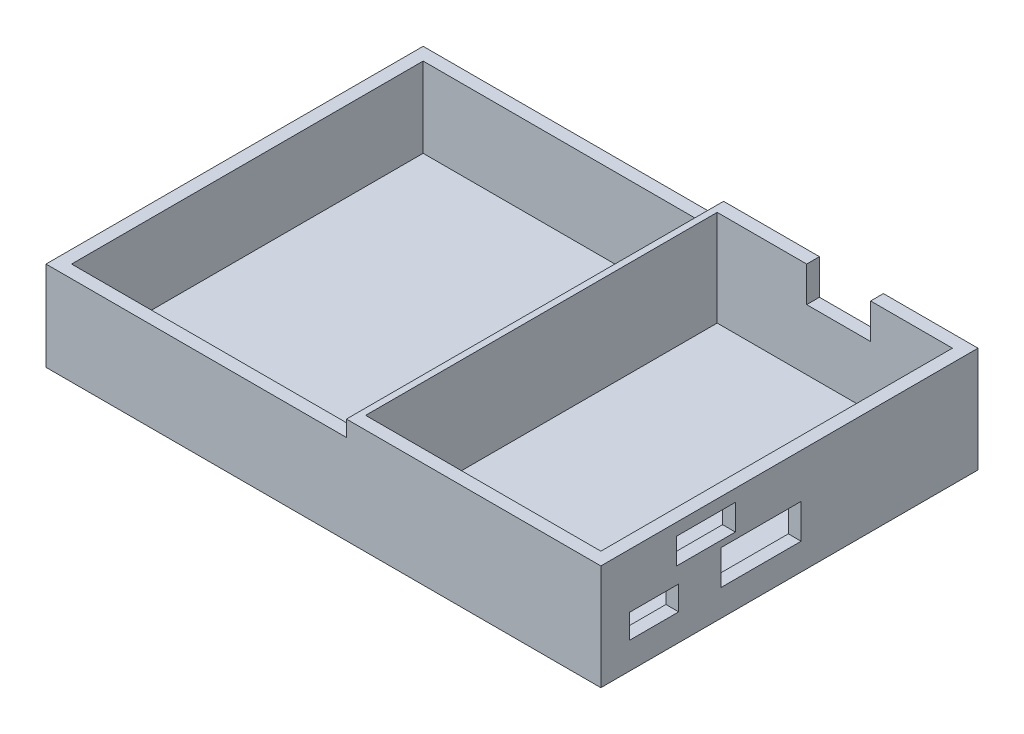
ISO-10303-21;
HEADER;
FILE_DESCRIPTION(('STEP AP214'),'2;1');
FILE_NAME('part.step','',(''),(''),'','','');
FILE_SCHEMA(('AUTOMOTIVE_DESIGN { 1 0 10303 214 1 1 1 1 }'));
ENDSEC;
DATA;
#1=APPLICATION_CONTEXT('core data for automotive mechanical design processes');
#2=APPLICATION_PROTOCOL_DEFINITION('international standard','automotive_design',2000,#1);
#3=PRODUCT_CONTEXT('',#1,'mechanical');
#4=PRODUCT('Part','Part','',(#3));
#5=PRODUCT_RELATED_PRODUCT_CATEGORY('part','',(#4));
#6=PRODUCT_DEFINITION_FORMATION('','',#4);
#7=PRODUCT_DEFINITION_CONTEXT('part definition',#1,'design');
#8=PRODUCT_DEFINITION('design','',#6,#7);
#9=PRODUCT_DEFINITION_SHAPE('','',#8);
#10=(LENGTH_UNIT() NAMED_UNIT(*) SI_UNIT(.MILLI.,.METRE.));
#11=(NAMED_UNIT(*) PLANE_ANGLE_UNIT() SI_UNIT($,.RADIAN.));
#12=(NAMED_UNIT(*) SI_UNIT($,.STERADIAN.) SOLID_ANGLE_UNIT());
#13=UNCERTAINTY_MEASURE_WITH_UNIT(LENGTH_MEASURE(1.E-05),#10,'distance_accuracy_value','');
#14=(GEOMETRIC_REPRESENTATION_CONTEXT(3) GLOBAL_UNCERTAINTY_ASSIGNED_CONTEXT((#13)) GLOBAL_UNIT_ASSIGNED_CONTEXT((#10,
#11,#12)) REPRESENTATION_CONTEXT('',''));
#15=CARTESIAN_POINT('',(0.,0.,0.));
#16=DIRECTION('',(0.,0.,1.));
#17=DIRECTION('',(1.,0.,0.));
#18=AXIS2_PLACEMENT_3D('',#15,#16,#17);
#19=CARTESIAN_POINT('',(0.,12.5,27.5));
#20=DIRECTION('',(0.,0.,1.));
#21=DIRECTION('',(1.,0.,0.));
#22=AXIS2_PLACEMENT_3D('',#19,#20,#21);
#23=PLANE('',#22);
#24=DIRECTION('',(-1.,0.,0.));
#25=VECTOR('',#24,1.);
#26=CARTESIAN_POINT('',(0.,12.5,27.5));
#27=LINE('',#26,#25);
#28=CARTESIAN_POINT('',(22.5,12.5,27.5));
#29=VERTEX_POINT('',#28);
#30=CARTESIAN_POINT('',(-22.5,12.5,27.5));
#31=VERTEX_POINT('',#30);
#32=EDGE_CURVE('E458',#29,#31,#27,.T.);
#33=ORIENTED_EDGE('',*,*,#32,.F.);
#34=DIRECTION('',(0.,-1.,0.));
#35=VECTOR('',#34,1.);
#36=CARTESIAN_POINT('',(22.5,15.,27.5));
#37=LINE('',#36,#35);
#38=CARTESIAN_POINT('',(22.5,0.,27.5));
#39=VERTEX_POINT('',#38);
#40=EDGE_CURVE('E400',#29,#39,#37,.T.);
#41=ORIENTED_EDGE('',*,*,#40,.T.);
#42=DIRECTION('',(-1.,0.,0.));
#43=VECTOR('',#42,1.);
#44=CARTESIAN_POINT('',(0.,0.,27.5));
#45=LINE('',#44,#43);
#46=CARTESIAN_POINT('',(-22.5,0.,27.5));
#47=VERTEX_POINT('',#46);
#48=EDGE_CURVE('E454',#39,#47,#45,.T.);
#49=ORIENTED_EDGE('',*,*,#48,.T.);
#50=DIRECTION('',(0.,-1.,0.));
#51=VECTOR('',#50,1.);
#52=CARTESIAN_POINT('',(-22.5,12.5,27.5));
#53=LINE('',#52,#51);
#54=EDGE_CURVE('E505',#31,#47,#53,.T.);
#55=ORIENTED_EDGE('',*,*,#54,.F.);
#56=EDGE_LOOP('',(#33,#41,#49,#55));
#57=FACE_BOUND('',#56,.T.);
#58=ADVANCED_FACE('F44',(#57),#23,.F.);
#59=CARTESIAN_POINT('',(0.,12.5,-27.5));
#60=DIRECTION('',(0.,0.,1.));
#61=DIRECTION('',(1.,0.,0.));
#62=AXIS2_PLACEMENT_3D('',#59,#60,#61);
#63=PLANE('',#62);
#64=DIRECTION('',(0.,-1.,0.));
#65=VECTOR('',#64,1.);
#66=CARTESIAN_POINT('',(22.5,15.,-27.5));
#67=LINE('',#66,#65);
#68=CARTESIAN_POINT('',(22.5,12.5,-27.5));
#69=VERTEX_POINT('',#68);
#70=CARTESIAN_POINT('',(22.5,0.,-27.5));
#71=VERTEX_POINT('',#70);
#72=EDGE_CURVE('E383',#69,#71,#67,.T.);
#73=ORIENTED_EDGE('',*,*,#72,.F.);
#74=DIRECTION('',(-1.,0.,0.));
#75=VECTOR('',#74,1.);
#76=CARTESIAN_POINT('',(0.,12.5,-27.5));
#77=LINE('',#76,#75);
#78=CARTESIAN_POINT('',(-22.5,12.5,-27.5));
#79=VERTEX_POINT('',#78);
#80=EDGE_CURVE('E465',#69,#79,#77,.T.);
#81=ORIENTED_EDGE('',*,*,#80,.T.);
#82=DIRECTION('',(0.,-1.,0.));
#83=VECTOR('',#82,1.);
#84=CARTESIAN_POINT('',(-22.5,12.5,-27.5));
#85=LINE('',#84,#83);
#86=CARTESIAN_POINT('',(-22.5,0.,-27.5));
#87=VERTEX_POINT('',#86);
#88=EDGE_CURVE('E501',#79,#87,#85,.T.);
#89=ORIENTED_EDGE('',*,*,#88,.T.);
#90=DIRECTION('',(-1.,0.,0.));
#91=VECTOR('',#90,1.);
#92=CARTESIAN_POINT('',(0.,0.,-27.5));
#93=LINE('',#92,#91);
#94=EDGE_CURVE('E492',#71,#87,#93,.T.);
#95=ORIENTED_EDGE('',*,*,#94,.F.);
#96=EDGE_LOOP('',(#73,#81,#89,#95));
#97=FACE_BOUND('',#96,.T.);
#98=ADVANCED_FACE('F623',(#97),#63,.T.);
#99=CARTESIAN_POINT('',(60.3,0.,27.5));
#100=VERTEX_POINT('',#99);
#101=CARTESIAN_POINT('',(23.5,0.,27.5));
#102=VERTEX_POINT('',#101);
#103=EDGE_CURVE('E485',#100,#102,#45,.T.);
#104=ORIENTED_EDGE('',*,*,#103,.T.);
#105=DIRECTION('',(0.,-1.,0.));
#106=VECTOR('',#105,1.);
#107=CARTESIAN_POINT('',(23.5,15.,27.5));
#108=LINE('',#107,#106);
#109=CARTESIAN_POINT('',(23.5,15.,27.5));
#110=VERTEX_POINT('',#109);
#111=EDGE_CURVE('E396',#110,#102,#108,.T.);
#112=ORIENTED_EDGE('',*,*,#111,.F.);
#113=DIRECTION('',(1.,0.,0.));
#114=VECTOR('',#113,1.);
#115=CARTESIAN_POINT('',(0.,15.,27.4999999999999));
#116=LINE('',#115,#114);
#117=CARTESIAN_POINT('',(60.3,15.,27.5));
#118=VERTEX_POINT('',#117);
#119=EDGE_CURVE('E405',#110,#118,#116,.T.);
#120=ORIENTED_EDGE('',*,*,#119,.T.);
#121=DIRECTION('',(0.,-1.,0.));
#122=VECTOR('',#121,1.);
#123=CARTESIAN_POINT('',(60.3,15.,27.5));
#124=LINE('',#123,#122);
#125=EDGE_CURVE('E431',#118,#100,#124,.T.);
#126=ORIENTED_EDGE('',*,*,#125,.T.);
#127=EDGE_LOOP('',(#104,#112,#120,#126));
#128=FACE_BOUND('',#127,.T.);
#129=ADVANCED_FACE('F46',(#128),#23,.F.);
#130=CARTESIAN_POINT('',(-22.5,12.5,0.));
#131=DIRECTION('',(-1.,0.,0.));
#132=DIRECTION('',(0.,0.,1.));
#133=AXIS2_PLACEMENT_3D('',#130,#131,#132);
#134=PLANE('',#133);
#135=DIRECTION('',(0.,0.,-1.));
#136=VECTOR('',#135,1.);
#137=CARTESIAN_POINT('',(-22.5,0.,0.));
#138=LINE('',#137,#136);
#139=EDGE_CURVE('E488',#47,#87,#138,.T.);
#140=ORIENTED_EDGE('',*,*,#139,.T.);
#141=ORIENTED_EDGE('',*,*,#88,.F.);
#142=DIRECTION('',(0.,0.,-1.));
#143=VECTOR('',#142,1.);
#144=CARTESIAN_POINT('',(-22.5,12.5,0.));
#145=LINE('',#144,#143);
#146=EDGE_CURVE('E462',#31,#79,#145,.T.);
#147=ORIENTED_EDGE('',*,*,#146,.F.);
#148=ORIENTED_EDGE('',*,*,#54,.T.);
#149=EDGE_LOOP('',(#140,#141,#147,#148));
#150=FACE_BOUND('',#149,.T.);
#151=ADVANCED_FACE('F620',(#150),#134,.F.);
#152=DIRECTION('',(0.,1.,0.));
#153=VECTOR('',#152,1.);
#154=CARTESIAN_POINT('',(47.5,12.5,-27.5));
#155=LINE('',#154,#153);
#156=CARTESIAN_POINT('',(47.5,9.5,-27.5));
#157=VERTEX_POINT('',#156);
#158=CARTESIAN_POINT('',(47.5,15.,-27.5));
#159=VERTEX_POINT('',#158);
#160=EDGE_CURVE('E275',#157,#159,#155,.T.);
#161=ORIENTED_EDGE('',*,*,#160,.F.);
#162=DIRECTION('',(1.,0.,0.));
#163=VECTOR('',#162,1.);
#164=CARTESIAN_POINT('',(0.,9.5,-27.5));
#165=LINE('',#164,#163);
#166=CARTESIAN_POINT('',(37.5,9.5,-27.5));
#167=VERTEX_POINT('',#166);
#168=EDGE_CURVE('E249',#167,#157,#165,.T.);
#169=ORIENTED_EDGE('',*,*,#168,.F.);
#170=DIRECTION('',(0.,-1.,0.));
#171=VECTOR('',#170,1.);
#172=CARTESIAN_POINT('',(37.5,12.5,-27.5));
#173=LINE('',#172,#171);
#174=CARTESIAN_POINT('',(37.5,15.,-27.5));
#175=VERTEX_POINT('',#174);
#176=EDGE_CURVE('E271',#175,#167,#173,.T.);
#177=ORIENTED_EDGE('',*,*,#176,.F.);
#178=DIRECTION('',(1.,0.,0.));
#179=VECTOR('',#178,1.);
#180=CARTESIAN_POINT('',(1.9081958235745E-13,15.,-27.5000000000002));
#181=LINE('',#180,#179);
#182=CARTESIAN_POINT('',(23.5,15.,-27.5));
#183=VERTEX_POINT('',#182);
#184=EDGE_CURVE('E423',#183,#175,#181,.T.);
#185=ORIENTED_EDGE('',*,*,#184,.F.);
#186=DIRECTION('',(0.,-1.,0.));
#187=VECTOR('',#186,1.);
#188=CARTESIAN_POINT('',(23.5,15.,-27.5));
#189=LINE('',#188,#187);
#190=CARTESIAN_POINT('',(23.5,0.,-27.5));
#191=VERTEX_POINT('',#190);
#192=EDGE_CURVE('E393',#183,#191,#189,.T.);
#193=ORIENTED_EDGE('',*,*,#192,.T.);
#194=CARTESIAN_POINT('',(60.3,0.,-27.5));
#195=VERTEX_POINT('',#194);
#196=EDGE_CURVE('E459',#195,#191,#93,.T.);
#197=ORIENTED_EDGE('',*,*,#196,.F.);
#198=DIRECTION('',(0.,-1.,0.));
#199=VECTOR('',#198,1.);
#200=CARTESIAN_POINT('',(60.3,15.,-27.5));
#201=LINE('',#200,#199);
#202=CARTESIAN_POINT('',(60.3,15.,-27.5));
#203=VERTEX_POINT('',#202);
#204=EDGE_CURVE('E437',#203,#195,#201,.T.);
#205=ORIENTED_EDGE('',*,*,#204,.F.);
#206=EDGE_CURVE('E422',#159,#203,#181,.T.);
#207=ORIENTED_EDGE('',*,*,#206,.F.);
#208=EDGE_LOOP('',(#161,#169,#177,#185,#193,#197,#205,#207));
#209=FACE_BOUND('',#208,.T.);
#210=ADVANCED_FACE('F563',(#209),#63,.T.);
#211=CARTESIAN_POINT('',(0.,12.5,-29.5));
#212=DIRECTION('',(0.,0.,1.));
#213=DIRECTION('',(1.,0.,0.));
#214=AXIS2_PLACEMENT_3D('',#211,#212,#213);
#215=PLANE('',#214);
#216=DIRECTION('',(-1.,0.,0.));
#217=VECTOR('',#216,1.);
#218=CARTESIAN_POINT('',(47.5,9.5,-29.5));
#219=LINE('',#218,#217);
#220=CARTESIAN_POINT('',(47.5,9.5,-29.5));
#221=VERTEX_POINT('',#220);
#222=CARTESIAN_POINT('',(37.5,9.5,-29.5));
#223=VERTEX_POINT('',#222);
#224=EDGE_CURVE('E247',#221,#223,#219,.T.);
#225=ORIENTED_EDGE('',*,*,#224,.F.);
#226=DIRECTION('',(0.,-1.,0.));
#227=VECTOR('',#226,1.);
#228=CARTESIAN_POINT('',(47.5,15.,-29.5));
#229=LINE('',#228,#227);
#230=CARTESIAN_POINT('',(47.5,15.,-29.5));
#231=VERTEX_POINT('',#230);
#232=EDGE_CURVE('E256',#231,#221,#229,.T.);
#233=ORIENTED_EDGE('',*,*,#232,.F.);
#234=DIRECTION('',(1.,0.,0.));
#235=VECTOR('',#234,1.);
#236=CARTESIAN_POINT('',(0.,15.,-29.5));
#237=LINE('',#236,#235);
#238=CARTESIAN_POINT('',(62.3,15.,-29.5));
#239=VERTEX_POINT('',#238);
#240=EDGE_CURVE('E418',#231,#239,#237,.T.);
#241=ORIENTED_EDGE('',*,*,#240,.T.);
#242=DIRECTION('',(0.,-1.,0.));
#243=VECTOR('',#242,1.);
#244=CARTESIAN_POINT('',(62.3,15.,-29.5));
#245=LINE('',#244,#243);
#246=CARTESIAN_POINT('',(62.3,-1.5,-29.5));
#247=VERTEX_POINT('',#246);
#248=EDGE_CURVE('E444',#239,#247,#245,.T.);
#249=ORIENTED_EDGE('',*,*,#248,.T.);
#250=DIRECTION('',(-1.,0.,0.));
#251=VECTOR('',#250,1.);
#252=CARTESIAN_POINT('',(0.,-1.5,-29.5));
#253=LINE('',#252,#251);
#254=CARTESIAN_POINT('',(-24.5,-1.5,-29.5));
#255=VERTEX_POINT('',#254);
#256=EDGE_CURVE('E370',#247,#255,#253,.T.);
#257=ORIENTED_EDGE('',*,*,#256,.T.);
#258=DIRECTION('',(0.,-1.,0.));
#259=VECTOR('',#258,1.);
#260=CARTESIAN_POINT('',(-24.5,12.5,-29.5));
#261=LINE('',#260,#259);
#262=CARTESIAN_POINT('',(-24.5,12.5,-29.5));
#263=VERTEX_POINT('',#262);
#264=EDGE_CURVE('E498',#263,#255,#261,.T.);
#265=ORIENTED_EDGE('',*,*,#264,.F.);
#266=DIRECTION('',(-1.,0.,0.));
#267=VECTOR('',#266,1.);
#268=CARTESIAN_POINT('',(0.,12.5,-29.5));
#269=LINE('',#268,#267);
#270=CARTESIAN_POINT('',(22.5,12.5,-29.5));
#271=VERTEX_POINT('',#270);
#272=EDGE_CURVE('E473',#271,#263,#269,.T.);
#273=ORIENTED_EDGE('',*,*,#272,.F.);
#274=DIRECTION('',(0.,-1.,0.));
#275=VECTOR('',#274,1.);
#276=CARTESIAN_POINT('',(22.5,15.,-29.5));
#277=LINE('',#276,#275);
#278=CARTESIAN_POINT('',(22.5,15.,-29.5));
#279=VERTEX_POINT('',#278);
#280=EDGE_CURVE('E441',#279,#271,#277,.T.);
#281=ORIENTED_EDGE('',*,*,#280,.F.);
#282=CARTESIAN_POINT('',(37.5,15.,-29.5));
#283=VERTEX_POINT('',#282);
#284=EDGE_CURVE('E419',#279,#283,#237,.T.);
#285=ORIENTED_EDGE('',*,*,#284,.T.);
#286=DIRECTION('',(0.,1.,0.));
#287=VECTOR('',#286,1.);
#288=CARTESIAN_POINT('',(37.5,15.,-29.5));
#289=LINE('',#288,#287);
#290=EDGE_CURVE('E60',#223,#283,#289,.T.);
#291=ORIENTED_EDGE('',*,*,#290,.F.);
#292=EDGE_LOOP('',(#225,#233,#241,#249,#257,#265,#273,#281,#285,#291));
#293=FACE_BOUND('',#292,.T.);
#294=ADVANCED_FACE('F263',(#293),#215,.F.);
#295=CARTESIAN_POINT('',(-24.5,12.5,0.));
#296=DIRECTION('',(-1.,0.,0.));
#297=DIRECTION('',(0.,0.,1.));
#298=AXIS2_PLACEMENT_3D('',#295,#296,#297);
#299=PLANE('',#298);
#300=ORIENTED_EDGE('',*,*,#264,.T.);
#301=DIRECTION('',(0.,0.,-1.));
#302=VECTOR('',#301,1.);
#303=CARTESIAN_POINT('',(-24.5,-1.5,0.));
#304=LINE('',#303,#302);
#305=CARTESIAN_POINT('',(-24.5,-1.5,29.5));
#306=VERTEX_POINT('',#305);
#307=EDGE_CURVE('E374',#306,#255,#304,.T.);
#308=ORIENTED_EDGE('',*,*,#307,.F.);
#309=DIRECTION('',(0.,-1.,0.));
#310=VECTOR('',#309,1.);
#311=CARTESIAN_POINT('',(-24.5,12.5,29.5));
#312=LINE('',#311,#310);
#313=CARTESIAN_POINT('',(-24.5,12.5,29.5));
#314=VERTEX_POINT('',#313);
#315=EDGE_CURVE('E484',#314,#306,#312,.T.);
#316=ORIENTED_EDGE('',*,*,#315,.F.);
#317=DIRECTION('',(0.,0.,-1.));
#318=VECTOR('',#317,1.);
#319=CARTESIAN_POINT('',(-24.5,12.5,0.));
#320=LINE('',#319,#318);
#321=EDGE_CURVE('E476',#314,#263,#320,.T.);
#322=ORIENTED_EDGE('',*,*,#321,.T.);
#323=EDGE_LOOP('',(#300,#308,#316,#322));
#324=FACE_BOUND('',#323,.T.);
#325=ADVANCED_FACE('F604',(#324),#299,.T.);
#326=CARTESIAN_POINT('',(0.,12.5,29.5));
#327=DIRECTION('',(0.,0.,1.));
#328=DIRECTION('',(1.,0.,0.));
#329=AXIS2_PLACEMENT_3D('',#326,#327,#328);
#330=PLANE('',#329);
#331=ORIENTED_EDGE('',*,*,#315,.T.);
#332=DIRECTION('',(-1.,0.,0.));
#333=VECTOR('',#332,1.);
#334=CARTESIAN_POINT('',(0.,-1.5,29.5));
#335=LINE('',#334,#333);
#336=CARTESIAN_POINT('',(62.3,-1.5,29.5));
#337=VERTEX_POINT('',#336);
#338=EDGE_CURVE('E353',#337,#306,#335,.T.);
#339=ORIENTED_EDGE('',*,*,#338,.F.);
#340=DIRECTION('',(0.,-1.,0.));
#341=VECTOR('',#340,1.);
#342=CARTESIAN_POINT('',(62.3,15.,29.5));
#343=LINE('',#342,#341);
#344=CARTESIAN_POINT('',(62.3,15.,29.5));
#345=VERTEX_POINT('',#344);
#346=EDGE_CURVE('E447',#345,#337,#343,.T.);
#347=ORIENTED_EDGE('',*,*,#346,.F.);
#348=DIRECTION('',(1.,0.,0.));
#349=VECTOR('',#348,1.);
#350=CARTESIAN_POINT('',(0.,15.,29.5));
#351=LINE('',#350,#349);
#352=CARTESIAN_POINT('',(22.5,15.,29.5));
#353=VERTEX_POINT('',#352);
#354=EDGE_CURVE('E411',#353,#345,#351,.T.);
#355=ORIENTED_EDGE('',*,*,#354,.F.);
#356=DIRECTION('',(0.,-1.,0.));
#357=VECTOR('',#356,1.);
#358=CARTESIAN_POINT('',(22.5,15.,29.5));
#359=LINE('',#358,#357);
#360=CARTESIAN_POINT('',(22.5,12.5,29.5));
#361=VERTEX_POINT('',#360);
#362=EDGE_CURVE('E450',#353,#361,#359,.T.);
#363=ORIENTED_EDGE('',*,*,#362,.T.);
#364=DIRECTION('',(-1.,0.,0.));
#365=VECTOR('',#364,1.);
#366=CARTESIAN_POINT('',(0.,12.5,29.5));
#367=LINE('',#366,#365);
#368=EDGE_CURVE('E480',#361,#314,#367,.T.);
#369=ORIENTED_EDGE('',*,*,#368,.T.);
#370=EDGE_LOOP('',(#331,#339,#347,#355,#363,#369));
#371=FACE_BOUND('',#370,.T.);
#372=ADVANCED_FACE('F594',(#371),#330,.T.);
#373=CARTESIAN_POINT('',(0.,12.5,0.));
#374=DIRECTION('',(0.,1.,0.));
#375=DIRECTION('',(0.,0.,1.));
#376=AXIS2_PLACEMENT_3D('',#373,#374,#375);
#377=PLANE('',#376);
#378=DIRECTION('',(0.,0.,1.));
#379=VECTOR('',#378,1.);
#380=CARTESIAN_POINT('',(22.5,12.5,0.));
#381=LINE('',#380,#379);
#382=EDGE_CURVE('E455',#29,#361,#381,.T.);
#383=ORIENTED_EDGE('',*,*,#382,.F.);
#384=ORIENTED_EDGE('',*,*,#32,.T.);
#385=ORIENTED_EDGE('',*,*,#146,.T.);
#386=ORIENTED_EDGE('',*,*,#80,.F.);
#387=DIRECTION('',(0.,0.,1.));
#388=VECTOR('',#387,1.);
#389=CARTESIAN_POINT('',(22.5,12.5,0.));
#390=LINE('',#389,#388);
#391=EDGE_CURVE('E469',#271,#69,#390,.T.);
#392=ORIENTED_EDGE('',*,*,#391,.F.);
#393=ORIENTED_EDGE('',*,*,#272,.T.);
#394=ORIENTED_EDGE('',*,*,#321,.F.);
#395=ORIENTED_EDGE('',*,*,#368,.F.);
#396=EDGE_LOOP('',(#383,#384,#385,#386,#392,#393,#394,#395));
#397=FACE_BOUND('',#396,.T.);
#398=ADVANCED_FACE('F608',(#397),#377,.T.);
#399=CARTESIAN_POINT('',(22.5,15.,0.));
#400=DIRECTION('',(1.,0.,0.));
#401=DIRECTION('',(0.,0.,-1.));
#402=AXIS2_PLACEMENT_3D('',#399,#400,#401);
#403=PLANE('',#402);
#404=ORIENTED_EDGE('',*,*,#382,.T.);
#405=ORIENTED_EDGE('',*,*,#362,.F.);
#406=DIRECTION('',(0.,0.,1.));
#407=VECTOR('',#406,1.);
#408=CARTESIAN_POINT('',(22.5,15.,0.));
#409=LINE('',#408,#407);
#410=EDGE_CURVE('E408',#279,#353,#409,.T.);
#411=ORIENTED_EDGE('',*,*,#410,.F.);
#412=ORIENTED_EDGE('',*,*,#280,.T.);
#413=ORIENTED_EDGE('',*,*,#391,.T.);
#414=ORIENTED_EDGE('',*,*,#72,.T.);
#415=DIRECTION('',(0.,0.,-1.));
#416=VECTOR('',#415,1.);
#417=CARTESIAN_POINT('',(22.5,0.,0.));
#418=LINE('',#417,#416);
#419=EDGE_CURVE('E378',#39,#71,#418,.T.);
#420=ORIENTED_EDGE('',*,*,#419,.F.);
#421=ORIENTED_EDGE('',*,*,#40,.F.);
#422=EDGE_LOOP('',(#404,#405,#411,#412,#413,#414,#420,#421));
#423=FACE_BOUND('',#422,.T.);
#424=ADVANCED_FACE('F610',(#423),#403,.F.);
#425=CARTESIAN_POINT('',(62.3,15.,0.));
#426=DIRECTION('',(1.,0.,0.));
#427=DIRECTION('',(0.,0.,-1.));
#428=AXIS2_PLACEMENT_3D('',#425,#426,#427);
#429=PLANE('',#428);
#430=DIRECTION('',(0.,0.,-1.));
#431=VECTOR('',#430,1.);
#432=CARTESIAN_POINT('',(62.3,2.68005623563339,10.670199999999));
#433=LINE('',#432,#431);
#434=CARTESIAN_POINT('',(62.3,2.68005623563339,10.670199999999));
#435=VERTEX_POINT('',#434);
#436=CARTESIAN_POINT('',(62.3,2.68005623563339,-1.829800000001));
#437=VERTEX_POINT('',#436);
#438=EDGE_CURVE('E68',#435,#437,#433,.T.);
#439=ORIENTED_EDGE('',*,*,#438,.F.);
#440=DIRECTION('',(0.,-1.,0.));
#441=VECTOR('',#440,1.);
#442=CARTESIAN_POINT('',(62.3,2.68005623563339,10.670199999999));
#443=LINE('',#442,#441);
#444=CARTESIAN_POINT('',(62.3,8.08005623563339,10.670199999999));
#445=VERTEX_POINT('',#444);
#446=EDGE_CURVE('E313',#445,#435,#443,.T.);
#447=ORIENTED_EDGE('',*,*,#446,.F.);
#448=DIRECTION('',(0.,0.,1.));
#449=VECTOR('',#448,1.);
#450=CARTESIAN_POINT('',(62.3,8.08005623563339,10.670199999999));
#451=LINE('',#450,#449);
#452=CARTESIAN_POINT('',(62.3,8.08005623563339,-1.829800000001));
#453=VERTEX_POINT('',#452);
#454=EDGE_CURVE('E325',#453,#445,#451,.T.);
#455=ORIENTED_EDGE('',*,*,#454,.F.);
#456=DIRECTION('',(0.,1.,0.));
#457=VECTOR('',#456,1.);
#458=CARTESIAN_POINT('',(62.3,2.68005623563339,-1.829800000001));
#459=LINE('',#458,#457);
#460=EDGE_CURVE('E329',#437,#453,#459,.T.);
#461=ORIENTED_EDGE('',*,*,#460,.F.);
#462=EDGE_LOOP('',(#439,#447,#455,#461));
#463=FACE_BOUND('',#462,.T.);
#464=DIRECTION('',(0.,-1.,0.));
#465=VECTOR('',#464,1.);
#466=CARTESIAN_POINT('',(62.3,9.06825733,17.6602083341472));
#467=LINE('',#466,#465);
#468=CARTESIAN_POINT('',(62.3,13.1,17.6602083341472));
#469=VERTEX_POINT('',#468);
#470=CARTESIAN_POINT('',(62.3,9.06825733,17.6602083341472));
#471=VERTEX_POINT('',#470);
#472=EDGE_CURVE('E306',#469,#471,#467,.T.);
#473=ORIENTED_EDGE('',*,*,#472,.F.);
#474=DIRECTION('',(0.,0.,1.));
#475=VECTOR('',#474,1.);
#476=CARTESIAN_POINT('',(62.3,13.1,17.6602083341472));
#477=LINE('',#476,#475);
#478=CARTESIAN_POINT('',(62.3,13.1,8.46020833414721));
#479=VERTEX_POINT('',#478);
#480=EDGE_CURVE('E285',#479,#469,#477,.T.);
#481=ORIENTED_EDGE('',*,*,#480,.F.);
#482=DIRECTION('',(0.,1.,0.));
#483=VECTOR('',#482,1.);
#484=CARTESIAN_POINT('',(62.3,9.06825733,8.46020833414721));
#485=LINE('',#484,#483);
#486=CARTESIAN_POINT('',(62.3,9.06825733,8.46020833414721));
#487=VERTEX_POINT('',#486);
#488=EDGE_CURVE('E298',#487,#479,#485,.T.);
#489=ORIENTED_EDGE('',*,*,#488,.F.);
#490=DIRECTION('',(0.,0.,-1.));
#491=VECTOR('',#490,1.);
#492=CARTESIAN_POINT('',(62.3,9.06825733,17.6602083341472));
#493=LINE('',#492,#491);
#494=EDGE_CURVE('E302',#471,#487,#493,.T.);
#495=ORIENTED_EDGE('',*,*,#494,.F.);
#496=EDGE_LOOP('',(#473,#481,#489,#495));
#497=FACE_BOUND('',#496,.T.);
#498=DIRECTION('',(0.,-1.,0.));
#499=VECTOR('',#498,1.);
#500=CARTESIAN_POINT('',(62.3,2.68477666438514,25.));
#501=LINE('',#500,#499);
#502=CARTESIAN_POINT('',(62.3,6.47005623563348,25.));
#503=VERTEX_POINT('',#502);
#504=CARTESIAN_POINT('',(62.3,2.68477666438514,25.));
#505=VERTEX_POINT('',#504);
#506=EDGE_CURVE('E309',#503,#505,#501,.T.);
#507=ORIENTED_EDGE('',*,*,#506,.F.);
#508=DIRECTION('',(0.,0.,1.));
#509=VECTOR('',#508,1.);
#510=CARTESIAN_POINT('',(62.3,6.47005623563348,25.));
#511=LINE('',#510,#509);
#512=CARTESIAN_POINT('',(62.3,6.47005623563348,17.317199999999));
#513=VERTEX_POINT('',#512);
#514=EDGE_CURVE('E345',#513,#503,#511,.T.);
#515=ORIENTED_EDGE('',*,*,#514,.F.);
#516=DIRECTION('',(0.,1.,0.));
#517=VECTOR('',#516,1.);
#518=CARTESIAN_POINT('',(62.3,2.68477666438514,17.317199999999));
#519=LINE('',#518,#517);
#520=CARTESIAN_POINT('',(62.3,2.68477666438514,17.317199999999));
#521=VERTEX_POINT('',#520);
#522=EDGE_CURVE('E341',#521,#513,#519,.T.);
#523=ORIENTED_EDGE('',*,*,#522,.F.);
#524=DIRECTION('',(0.,0.,-1.));
#525=VECTOR('',#524,1.);
#526=CARTESIAN_POINT('',(62.3,2.68477666438514,25.));
#527=LINE('',#526,#525);
#528=EDGE_CURVE('E337',#505,#521,#527,.T.);
#529=ORIENTED_EDGE('',*,*,#528,.F.);
#530=EDGE_LOOP('',(#507,#515,#523,#529));
#531=FACE_BOUND('',#530,.T.);
#532=ORIENTED_EDGE('',*,*,#346,.T.);
#533=DIRECTION('',(0.,0.,1.));
#534=VECTOR('',#533,1.);
#535=CARTESIAN_POINT('',(62.3,-1.5,0.));
#536=LINE('',#535,#534);
#537=EDGE_CURVE('E366',#247,#337,#536,.T.);
#538=ORIENTED_EDGE('',*,*,#537,.F.);
#539=ORIENTED_EDGE('',*,*,#248,.F.);
#540=DIRECTION('',(0.,0.,1.));
#541=VECTOR('',#540,1.);
#542=CARTESIAN_POINT('',(62.3,15.,0.));
#543=LINE('',#542,#541);
#544=EDGE_CURVE('E414',#239,#345,#543,.T.);
#545=ORIENTED_EDGE('',*,*,#544,.T.);
#546=EDGE_LOOP('',(#532,#538,#539,#545));
#547=FACE_BOUND('',#546,.T.);
#548=ADVANCED_FACE('F587',(#463,#497,#531,#547),#429,.T.);
#549=CARTESIAN_POINT('',(60.3,15.,0.));
#550=DIRECTION('',(1.,0.,0.));
#551=DIRECTION('',(0.,0.,-1.));
#552=AXIS2_PLACEMENT_3D('',#549,#550,#551);
#553=PLANE('',#552);
#554=DIRECTION('',(0.,-1.,0.));
#555=VECTOR('',#554,1.);
#556=CARTESIAN_POINT('',(60.3,15.,10.670199999999));
#557=LINE('',#556,#555);
#558=CARTESIAN_POINT('',(60.3,8.08005623563339,10.670199999999));
#559=VERTEX_POINT('',#558);
#560=CARTESIAN_POINT('',(60.3,2.68005623563339,10.670199999999));
#561=VERTEX_POINT('',#560);
#562=EDGE_CURVE('E549',#559,#561,#557,.T.);
#563=ORIENTED_EDGE('',*,*,#562,.T.);
#564=DIRECTION('',(0.,0.,-1.));
#565=VECTOR('',#564,1.);
#566=CARTESIAN_POINT('',(60.3,2.68005623563339,0.));
#567=LINE('',#566,#565);
#568=CARTESIAN_POINT('',(60.3,2.68005623563339,-1.829800000001));
#569=VERTEX_POINT('',#568);
#570=EDGE_CURVE('E553',#561,#569,#567,.T.);
#571=ORIENTED_EDGE('',*,*,#570,.T.);
#572=DIRECTION('',(0.,1.,0.));
#573=VECTOR('',#572,1.);
#574=CARTESIAN_POINT('',(60.3,15.,-1.829800000001));
#575=LINE('',#574,#573);
#576=CARTESIAN_POINT('',(60.3,8.08005623563339,-1.829800000001));
#577=VERTEX_POINT('',#576);
#578=EDGE_CURVE('E541',#569,#577,#575,.T.);
#579=ORIENTED_EDGE('',*,*,#578,.T.);
#580=DIRECTION('',(0.,0.,1.));
#581=VECTOR('',#580,1.);
#582=CARTESIAN_POINT('',(60.3,8.08005623563339,0.));
#583=LINE('',#582,#581);
#584=EDGE_CURVE('E545',#577,#559,#583,.T.);
#585=ORIENTED_EDGE('',*,*,#584,.T.);
#586=EDGE_LOOP('',(#563,#571,#579,#585));
#587=FACE_BOUND('',#586,.T.);
#588=DIRECTION('',(0.,0.,1.));
#589=VECTOR('',#588,1.);
#590=CARTESIAN_POINT('',(60.3,13.1,0.));
#591=LINE('',#590,#589);
#592=CARTESIAN_POINT('',(60.3,13.1,8.46020833414721));
#593=VERTEX_POINT('',#592);
#594=CARTESIAN_POINT('',(60.3,13.1,17.6602083341472));
#595=VERTEX_POINT('',#594);
#596=EDGE_CURVE('E533',#593,#595,#591,.T.);
#597=ORIENTED_EDGE('',*,*,#596,.T.);
#598=DIRECTION('',(0.,-1.,0.));
#599=VECTOR('',#598,1.);
#600=CARTESIAN_POINT('',(60.3,15.,17.6602083341472));
#601=LINE('',#600,#599);
#602=CARTESIAN_POINT('',(60.3,9.06825733,17.6602083341472));
#603=VERTEX_POINT('',#602);
#604=EDGE_CURVE('E537',#595,#603,#601,.T.);
#605=ORIENTED_EDGE('',*,*,#604,.T.);
#606=DIRECTION('',(0.,0.,-1.));
#607=VECTOR('',#606,1.);
#608=CARTESIAN_POINT('',(60.3,9.06825733,0.));
#609=LINE('',#608,#607);
#610=CARTESIAN_POINT('',(60.3,9.06825733,8.46020833414721));
#611=VERTEX_POINT('',#610);
#612=EDGE_CURVE('E525',#603,#611,#609,.T.);
#613=ORIENTED_EDGE('',*,*,#612,.T.);
#614=DIRECTION('',(0.,1.,0.));
#615=VECTOR('',#614,1.);
#616=CARTESIAN_POINT('',(60.3,15.,8.46020833414721));
#617=LINE('',#616,#615);
#618=EDGE_CURVE('E529',#611,#593,#617,.T.);
#619=ORIENTED_EDGE('',*,*,#618,.T.);
#620=EDGE_LOOP('',(#597,#605,#613,#619));
#621=FACE_BOUND('',#620,.T.);
#622=DIRECTION('',(0.,0.,1.));
#623=VECTOR('',#622,1.);
#624=CARTESIAN_POINT('',(60.3,6.47005623563348,0.));
#625=LINE('',#624,#623);
#626=CARTESIAN_POINT('',(60.3,6.47005623563348,17.317199999999));
#627=VERTEX_POINT('',#626);
#628=CARTESIAN_POINT('',(60.3,6.47005623563348,25.));
#629=VERTEX_POINT('',#628);
#630=EDGE_CURVE('E517',#627,#629,#625,.T.);
#631=ORIENTED_EDGE('',*,*,#630,.T.);
#632=DIRECTION('',(0.,-1.,0.));
#633=VECTOR('',#632,1.);
#634=CARTESIAN_POINT('',(60.3,15.,25.));
#635=LINE('',#634,#633);
#636=CARTESIAN_POINT('',(60.3,2.68477666438514,25.));
#637=VERTEX_POINT('',#636);
#638=EDGE_CURVE('E521',#629,#637,#635,.T.);
#639=ORIENTED_EDGE('',*,*,#638,.T.);
#640=DIRECTION('',(0.,0.,-1.));
#641=VECTOR('',#640,1.);
#642=CARTESIAN_POINT('',(60.3,2.68477666438514,0.));
#643=LINE('',#642,#641);
#644=CARTESIAN_POINT('',(60.3,2.68477666438514,17.317199999999));
#645=VERTEX_POINT('',#644);
#646=EDGE_CURVE('E509',#637,#645,#643,.T.);
#647=ORIENTED_EDGE('',*,*,#646,.T.);
#648=DIRECTION('',(0.,1.,0.));
#649=VECTOR('',#648,1.);
#650=CARTESIAN_POINT('',(60.3,15.,17.317199999999));
#651=LINE('',#650,#649);
#652=EDGE_CURVE('E513',#645,#627,#651,.T.);
#653=ORIENTED_EDGE('',*,*,#652,.T.);
#654=EDGE_LOOP('',(#631,#639,#647,#653));
#655=FACE_BOUND('',#654,.T.);
#656=DIRECTION('',(0.,0.,1.));
#657=VECTOR('',#656,1.);
#658=CARTESIAN_POINT('',(60.3,0.,0.));
#659=LINE('',#658,#657);
#660=EDGE_CURVE('E404',#195,#100,#659,.T.);
#661=ORIENTED_EDGE('',*,*,#660,.T.);
#662=ORIENTED_EDGE('',*,*,#125,.F.);
#663=DIRECTION('',(0.,0.,1.));
#664=VECTOR('',#663,1.);
#665=CARTESIAN_POINT('',(60.3,15.,0.));
#666=LINE('',#665,#664);
#667=EDGE_CURVE('E427',#203,#118,#666,.T.);
#668=ORIENTED_EDGE('',*,*,#667,.F.);
#669=ORIENTED_EDGE('',*,*,#204,.T.);
#670=EDGE_LOOP('',(#661,#662,#668,#669));
#671=FACE_BOUND('',#670,.T.);
#672=ADVANCED_FACE('F576',(#587,#621,#655,#671),#553,.F.);
#673=CARTESIAN_POINT('',(0.,15.,0.));
#674=DIRECTION('',(0.,1.,0.));
#675=DIRECTION('',(0.,0.,1.));
#676=AXIS2_PLACEMENT_3D('',#673,#674,#675);
#677=PLANE('',#676);
#678=DIRECTION('',(0.,0.,-1.));
#679=VECTOR('',#678,1.);
#680=CARTESIAN_POINT('',(47.5,15.,0.));
#681=LINE('',#680,#679);
#682=EDGE_CURVE('E11',#159,#231,#681,.T.);
#683=ORIENTED_EDGE('',*,*,#682,.F.);
#684=ORIENTED_EDGE('',*,*,#206,.T.);
#685=ORIENTED_EDGE('',*,*,#667,.T.);
#686=ORIENTED_EDGE('',*,*,#119,.F.);
#687=DIRECTION('',(0.,0.,1.));
#688=VECTOR('',#687,1.);
#689=CARTESIAN_POINT('',(23.5,15.,0.));
#690=LINE('',#689,#688);
#691=EDGE_CURVE('E379',#183,#110,#690,.T.);
#692=ORIENTED_EDGE('',*,*,#691,.F.);
#693=ORIENTED_EDGE('',*,*,#184,.T.);
#694=DIRECTION('',(0.,0.,1.));
#695=VECTOR('',#694,1.);
#696=CARTESIAN_POINT('',(37.5,15.,0.));
#697=LINE('',#696,#695);
#698=EDGE_CURVE('E53',#283,#175,#697,.T.);
#699=ORIENTED_EDGE('',*,*,#698,.F.);
#700=ORIENTED_EDGE('',*,*,#284,.F.);
#701=ORIENTED_EDGE('',*,*,#410,.T.);
#702=ORIENTED_EDGE('',*,*,#354,.T.);
#703=ORIENTED_EDGE('',*,*,#544,.F.);
#704=ORIENTED_EDGE('',*,*,#240,.F.);
#705=EDGE_LOOP('',(#683,#684,#685,#686,#692,#693,#699,#700,#701,#702,#703,#704));
#706=FACE_BOUND('',#705,.T.);
#707=ADVANCED_FACE('F564',(#706),#677,.T.);
#708=CARTESIAN_POINT('',(23.5,15.,0.));
#709=DIRECTION('',(1.,0.,0.));
#710=DIRECTION('',(0.,0.,-1.));
#711=AXIS2_PLACEMENT_3D('',#708,#709,#710);
#712=PLANE('',#711);
#713=DIRECTION('',(0.,0.,1.));
#714=VECTOR('',#713,1.);
#715=CARTESIAN_POINT('',(23.5,0.,0.));
#716=LINE('',#715,#714);
#717=EDGE_CURVE('E384',#191,#102,#716,.T.);
#718=ORIENTED_EDGE('',*,*,#717,.F.);
#719=ORIENTED_EDGE('',*,*,#192,.F.);
#720=ORIENTED_EDGE('',*,*,#691,.T.);
#721=ORIENTED_EDGE('',*,*,#111,.T.);
#722=EDGE_LOOP('',(#718,#719,#720,#721));
#723=FACE_BOUND('',#722,.T.);
#724=ADVANCED_FACE('F569',(#723),#712,.T.);
#725=CARTESIAN_POINT('',(0.,0.,0.));
#726=DIRECTION('',(0.,1.,0.));
#727=DIRECTION('',(0.,0.,1.));
#728=AXIS2_PLACEMENT_3D('',#725,#726,#727);
#729=PLANE('',#728);
#730=ORIENTED_EDGE('',*,*,#48,.F.);
#731=ORIENTED_EDGE('',*,*,#419,.T.);
#732=ORIENTED_EDGE('',*,*,#94,.T.);
#733=ORIENTED_EDGE('',*,*,#139,.F.);
#734=EDGE_LOOP('',(#730,#731,#732,#733));
#735=FACE_BOUND('',#734,.T.);
#736=ADVANCED_FACE('F627',(#735),#729,.T.);
#737=ORIENTED_EDGE('',*,*,#196,.T.);
#738=ORIENTED_EDGE('',*,*,#717,.T.);
#739=ORIENTED_EDGE('',*,*,#103,.F.);
#740=ORIENTED_EDGE('',*,*,#660,.F.);
#741=EDGE_LOOP('',(#737,#738,#739,#740));
#742=FACE_BOUND('',#741,.T.);
#743=ADVANCED_FACE('F579',(#742),#729,.T.);
#744=CARTESIAN_POINT('',(0.,-1.5,0.));
#745=DIRECTION('',(0.,1.,0.));
#746=DIRECTION('',(0.,0.,1.));
#747=AXIS2_PLACEMENT_3D('',#744,#745,#746);
#748=PLANE('',#747);
#749=ORIENTED_EDGE('',*,*,#338,.T.);
#750=ORIENTED_EDGE('',*,*,#307,.T.);
#751=ORIENTED_EDGE('',*,*,#256,.F.);
#752=ORIENTED_EDGE('',*,*,#537,.T.);
#753=EDGE_LOOP('',(#749,#750,#751,#752));
#754=FACE_BOUND('',#753,.T.);
#755=ADVANCED_FACE('F596',(#754),#748,.F.);
#756=CARTESIAN_POINT('',(52.3,2.68477666438514,25.));
#757=DIRECTION('',(0.,0.,1.));
#758=DIRECTION('',(1.,0.,0.));
#759=AXIS2_PLACEMENT_3D('',#756,#757,#758);
#760=PLANE('',#759);
#761=DIRECTION('',(1.,0.,0.));
#762=VECTOR('',#761,1.);
#763=CARTESIAN_POINT('',(52.3,6.47005623563348,25.));
#764=LINE('',#763,#762);
#765=EDGE_CURVE('E350',#629,#503,#764,.T.);
#766=ORIENTED_EDGE('',*,*,#765,.T.);
#767=ORIENTED_EDGE('',*,*,#506,.T.);
#768=DIRECTION('',(1.,0.,0.));
#769=VECTOR('',#768,1.);
#770=CARTESIAN_POINT('',(52.3,2.68477666438514,25.));
#771=LINE('',#770,#769);
#772=EDGE_CURVE('E349',#637,#505,#771,.T.);
#773=ORIENTED_EDGE('',*,*,#772,.F.);
#774=ORIENTED_EDGE('',*,*,#638,.F.);
#775=EDGE_LOOP('',(#766,#767,#773,#774));
#776=FACE_BOUND('',#775,.T.);
#777=ADVANCED_FACE('F704',(#776),#760,.F.);
#778=CARTESIAN_POINT('',(52.3,6.47005623563348,25.));
#779=DIRECTION('',(0.,1.,0.));
#780=DIRECTION('',(0.,0.,1.));
#781=AXIS2_PLACEMENT_3D('',#778,#779,#780);
#782=PLANE('',#781);
#783=DIRECTION('',(1.,0.,0.));
#784=VECTOR('',#783,1.);
#785=CARTESIAN_POINT('',(52.3,6.47005623563348,17.317199999999));
#786=LINE('',#785,#784);
#787=EDGE_CURVE('E354',#627,#513,#786,.T.);
#788=ORIENTED_EDGE('',*,*,#787,.T.);
#789=ORIENTED_EDGE('',*,*,#514,.T.);
#790=ORIENTED_EDGE('',*,*,#765,.F.);
#791=ORIENTED_EDGE('',*,*,#630,.F.);
#792=EDGE_LOOP('',(#788,#789,#790,#791));
#793=FACE_BOUND('',#792,.T.);
#794=ADVANCED_FACE('F726',(#793),#782,.F.);
#795=CARTESIAN_POINT('',(52.3,2.68477666438514,17.317199999999));
#796=DIRECTION('',(0.,0.,-1.));
#797=DIRECTION('',(-1.,0.,0.));
#798=AXIS2_PLACEMENT_3D('',#795,#796,#797);
#799=PLANE('',#798);
#800=DIRECTION('',(1.,0.,0.));
#801=VECTOR('',#800,1.);
#802=CARTESIAN_POINT('',(52.3,2.68477666438514,17.317199999999));
#803=LINE('',#802,#801);
#804=EDGE_CURVE('E357',#645,#521,#803,.T.);
#805=ORIENTED_EDGE('',*,*,#804,.T.);
#806=ORIENTED_EDGE('',*,*,#522,.T.);
#807=ORIENTED_EDGE('',*,*,#787,.F.);
#808=ORIENTED_EDGE('',*,*,#652,.F.);
#809=EDGE_LOOP('',(#805,#806,#807,#808));
#810=FACE_BOUND('',#809,.T.);
#811=ADVANCED_FACE('F737',(#810),#799,.F.);
#812=CARTESIAN_POINT('',(52.3,2.68477666438514,25.));
#813=DIRECTION('',(0.,-1.,0.));
#814=DIRECTION('',(0.,0.,-1.));
#815=AXIS2_PLACEMENT_3D('',#812,#813,#814);
#816=PLANE('',#815);
#817=ORIENTED_EDGE('',*,*,#772,.T.);
#818=ORIENTED_EDGE('',*,*,#528,.T.);
#819=ORIENTED_EDGE('',*,*,#804,.F.);
#820=ORIENTED_EDGE('',*,*,#646,.F.);
#821=EDGE_LOOP('',(#817,#818,#819,#820));
#822=FACE_BOUND('',#821,.T.);
#823=ADVANCED_FACE('F748',(#822),#816,.F.);
#824=CARTESIAN_POINT('',(52.3,9.06825733,17.6602083341472));
#825=DIRECTION('',(0.,0.,1.));
#826=DIRECTION('',(1.,0.,0.));
#827=AXIS2_PLACEMENT_3D('',#824,#825,#826);
#828=PLANE('',#827);
#829=DIRECTION('',(1.,0.,0.));
#830=VECTOR('',#829,1.);
#831=CARTESIAN_POINT('',(52.3,13.1,17.6602083341472));
#832=LINE('',#831,#830);
#833=EDGE_CURVE('E292',#595,#469,#832,.T.);
#834=ORIENTED_EDGE('',*,*,#833,.T.);
#835=ORIENTED_EDGE('',*,*,#472,.T.);
#836=DIRECTION('',(1.,0.,0.));
#837=VECTOR('',#836,1.);
#838=CARTESIAN_POINT('',(52.3,9.06825733,17.6602083341472));
#839=LINE('',#838,#837);
#840=EDGE_CURVE('E281',#603,#471,#839,.T.);
#841=ORIENTED_EDGE('',*,*,#840,.F.);
#842=ORIENTED_EDGE('',*,*,#604,.F.);
#843=EDGE_LOOP('',(#834,#835,#841,#842));
#844=FACE_BOUND('',#843,.T.);
#845=ADVANCED_FACE('F759',(#844),#828,.F.);
#846=CARTESIAN_POINT('',(52.3,13.1,17.6602083341472));
#847=DIRECTION('',(0.,1.,0.));
#848=DIRECTION('',(0.,0.,1.));
#849=AXIS2_PLACEMENT_3D('',#846,#847,#848);
#850=PLANE('',#849);
#851=DIRECTION('',(1.,0.,0.));
#852=VECTOR('',#851,1.);
#853=CARTESIAN_POINT('',(52.3,13.1,8.46020833414721));
#854=LINE('',#853,#852);
#855=EDGE_CURVE('E289',#593,#479,#854,.T.);
#856=ORIENTED_EDGE('',*,*,#855,.T.);
#857=ORIENTED_EDGE('',*,*,#480,.T.);
#858=ORIENTED_EDGE('',*,*,#833,.F.);
#859=ORIENTED_EDGE('',*,*,#596,.F.);
#860=EDGE_LOOP('',(#856,#857,#858,#859));
#861=FACE_BOUND('',#860,.T.);
#862=ADVANCED_FACE('F770',(#861),#850,.F.);
#863=CARTESIAN_POINT('',(52.3,9.06825733,8.46020833414721));
#864=DIRECTION('',(0.,0.,-1.));
#865=DIRECTION('',(-1.,0.,0.));
#866=AXIS2_PLACEMENT_3D('',#863,#864,#865);
#867=PLANE('',#866);
#868=DIRECTION('',(1.,0.,0.));
#869=VECTOR('',#868,1.);
#870=CARTESIAN_POINT('',(52.3,9.06825733,8.46020833414721));
#871=LINE('',#870,#869);
#872=EDGE_CURVE('E286',#611,#487,#871,.T.);
#873=ORIENTED_EDGE('',*,*,#872,.T.);
#874=ORIENTED_EDGE('',*,*,#488,.T.);
#875=ORIENTED_EDGE('',*,*,#855,.F.);
#876=ORIENTED_EDGE('',*,*,#618,.F.);
#877=EDGE_LOOP('',(#873,#874,#875,#876));
#878=FACE_BOUND('',#877,.T.);
#879=ADVANCED_FACE('F781',(#878),#867,.F.);
#880=CARTESIAN_POINT('',(52.3,9.06825733,17.6602083341472));
#881=DIRECTION('',(0.,-1.,0.));
#882=DIRECTION('',(0.,0.,-1.));
#883=AXIS2_PLACEMENT_3D('',#880,#881,#882);
#884=PLANE('',#883);
#885=ORIENTED_EDGE('',*,*,#840,.T.);
#886=ORIENTED_EDGE('',*,*,#494,.T.);
#887=ORIENTED_EDGE('',*,*,#872,.F.);
#888=ORIENTED_EDGE('',*,*,#612,.F.);
#889=EDGE_LOOP('',(#885,#886,#887,#888));
#890=FACE_BOUND('',#889,.T.);
#891=ADVANCED_FACE('F792',(#890),#884,.F.);
#892=CARTESIAN_POINT('',(52.3,2.68005623563339,10.670199999999));
#893=DIRECTION('',(0.,-1.,0.));
#894=DIRECTION('',(0.,0.,-1.));
#895=AXIS2_PLACEMENT_3D('',#892,#893,#894);
#896=PLANE('',#895);
#897=DIRECTION('',(1.,0.,0.));
#898=VECTOR('',#897,1.);
#899=CARTESIAN_POINT('',(52.3,2.68005623563339,10.670199999999));
#900=LINE('',#899,#898);
#901=EDGE_CURVE('E280',#561,#435,#900,.T.);
#902=ORIENTED_EDGE('',*,*,#901,.T.);
#903=ORIENTED_EDGE('',*,*,#438,.T.);
#904=DIRECTION('',(1.,0.,0.));
#905=VECTOR('',#904,1.);
#906=CARTESIAN_POINT('',(52.3,2.68005623563339,-1.829800000001));
#907=LINE('',#906,#905);
#908=EDGE_CURVE('E310',#569,#437,#907,.T.);
#909=ORIENTED_EDGE('',*,*,#908,.F.);
#910=ORIENTED_EDGE('',*,*,#570,.F.);
#911=EDGE_LOOP('',(#902,#903,#909,#910));
#912=FACE_BOUND('',#911,.T.);
#913=ADVANCED_FACE('F803',(#912),#896,.F.);
#914=CARTESIAN_POINT('',(52.3,2.68005623563339,10.670199999999));
#915=DIRECTION('',(0.,0.,1.));
#916=DIRECTION('',(1.,0.,0.));
#917=AXIS2_PLACEMENT_3D('',#914,#915,#916);
#918=PLANE('',#917);
#919=DIRECTION('',(1.,0.,0.));
#920=VECTOR('',#919,1.);
#921=CARTESIAN_POINT('',(52.3,8.08005623563339,10.670199999999));
#922=LINE('',#921,#920);
#923=EDGE_CURVE('E317',#559,#445,#922,.T.);
#924=ORIENTED_EDGE('',*,*,#923,.T.);
#925=ORIENTED_EDGE('',*,*,#446,.T.);
#926=ORIENTED_EDGE('',*,*,#901,.F.);
#927=ORIENTED_EDGE('',*,*,#562,.F.);
#928=EDGE_LOOP('',(#924,#925,#926,#927));
#929=FACE_BOUND('',#928,.T.);
#930=ADVANCED_FACE('F814',(#929),#918,.F.);
#931=CARTESIAN_POINT('',(52.3,8.08005623563339,10.670199999999));
#932=DIRECTION('',(0.,1.,0.));
#933=DIRECTION('',(0.,0.,1.));
#934=AXIS2_PLACEMENT_3D('',#931,#932,#933);
#935=PLANE('',#934);
#936=DIRECTION('',(1.,0.,0.));
#937=VECTOR('',#936,1.);
#938=CARTESIAN_POINT('',(52.3,8.08005623563339,-1.829800000001));
#939=LINE('',#938,#937);
#940=EDGE_CURVE('E314',#577,#453,#939,.T.);
#941=ORIENTED_EDGE('',*,*,#940,.T.);
#942=ORIENTED_EDGE('',*,*,#454,.T.);
#943=ORIENTED_EDGE('',*,*,#923,.F.);
#944=ORIENTED_EDGE('',*,*,#584,.F.);
#945=EDGE_LOOP('',(#941,#942,#943,#944));
#946=FACE_BOUND('',#945,.T.);
#947=ADVANCED_FACE('F824',(#946),#935,.F.);
#948=CARTESIAN_POINT('',(52.3,2.68005623563339,-1.829800000001));
#949=DIRECTION('',(0.,0.,-1.));
#950=DIRECTION('',(-1.,0.,0.));
#951=AXIS2_PLACEMENT_3D('',#948,#949,#950);
#952=PLANE('',#951);
#953=ORIENTED_EDGE('',*,*,#908,.T.);
#954=ORIENTED_EDGE('',*,*,#460,.T.);
#955=ORIENTED_EDGE('',*,*,#940,.F.);
#956=ORIENTED_EDGE('',*,*,#578,.F.);
#957=EDGE_LOOP('',(#953,#954,#955,#956));
#958=FACE_BOUND('',#957,.T.);
#959=ADVANCED_FACE('F835',(#958),#952,.F.);
#960=CARTESIAN_POINT('',(47.5,15.,-19.5));
#961=DIRECTION('',(1.,0.,0.));
#962=DIRECTION('',(0.,0.,-1.));
#963=AXIS2_PLACEMENT_3D('',#960,#961,#962);
#964=PLANE('',#963);
#965=ORIENTED_EDGE('',*,*,#160,.T.);
#966=ORIENTED_EDGE('',*,*,#682,.T.);
#967=ORIENTED_EDGE('',*,*,#232,.T.);
#968=DIRECTION('',(0.,0.,-1.));
#969=VECTOR('',#968,1.);
#970=CARTESIAN_POINT('',(47.5,9.5,-19.5));
#971=LINE('',#970,#969);
#972=EDGE_CURVE('E242',#157,#221,#971,.T.);
#973=ORIENTED_EDGE('',*,*,#972,.F.);
#974=EDGE_LOOP('',(#965,#966,#967,#973));
#975=FACE_BOUND('',#974,.T.);
#976=ADVANCED_FACE('F257',(#975),#964,.F.);
#977=CARTESIAN_POINT('',(37.5,15.,-19.5));
#978=DIRECTION('',(-1.,0.,0.));
#979=DIRECTION('',(0.,0.,1.));
#980=AXIS2_PLACEMENT_3D('',#977,#978,#979);
#981=PLANE('',#980);
#982=ORIENTED_EDGE('',*,*,#176,.T.);
#983=DIRECTION('',(0.,0.,-1.));
#984=VECTOR('',#983,1.);
#985=CARTESIAN_POINT('',(37.5,9.5,-19.5));
#986=LINE('',#985,#984);
#987=EDGE_CURVE('E253',#167,#223,#986,.T.);
#988=ORIENTED_EDGE('',*,*,#987,.T.);
#989=ORIENTED_EDGE('',*,*,#290,.T.);
#990=ORIENTED_EDGE('',*,*,#698,.T.);
#991=EDGE_LOOP('',(#982,#988,#989,#990));
#992=FACE_BOUND('',#991,.T.);
#993=ADVANCED_FACE('F558',(#992),#981,.F.);
#994=CARTESIAN_POINT('',(47.5,9.5,-19.5));
#995=DIRECTION('',(0.,-1.,0.));
#996=DIRECTION('',(0.,0.,-1.));
#997=AXIS2_PLACEMENT_3D('',#994,#995,#996);
#998=PLANE('',#997);
#999=ORIENTED_EDGE('',*,*,#168,.T.);
#1000=ORIENTED_EDGE('',*,*,#972,.T.);
#1001=ORIENTED_EDGE('',*,*,#224,.T.);
#1002=ORIENTED_EDGE('',*,*,#987,.F.);
#1003=EDGE_LOOP('',(#999,#1000,#1001,#1002));
#1004=FACE_BOUND('',#1003,.T.);
#1005=ADVANCED_FACE('F244',(#1004),#998,.F.);
#1006=CLOSED_SHELL('',(#58,#98,#129,#151,#210,#294,#325,#372,#398,#424,#548,#672,#707,#724,#736,
#743,#755,#777,#794,#811,#823,#845,#862,#879,#891,#913,#930,#947,#959,#976,#993,#1005));
#1007=MANIFOLD_SOLID_BREP('B2',#1006);
#1008=ADVANCED_BREP_SHAPE_REPRESENTATION('',(#18,#1007),#14);
#1009=SHAPE_DEFINITION_REPRESENTATION(#9,#1008);
ENDSEC;
END-ISO-10303-21;
